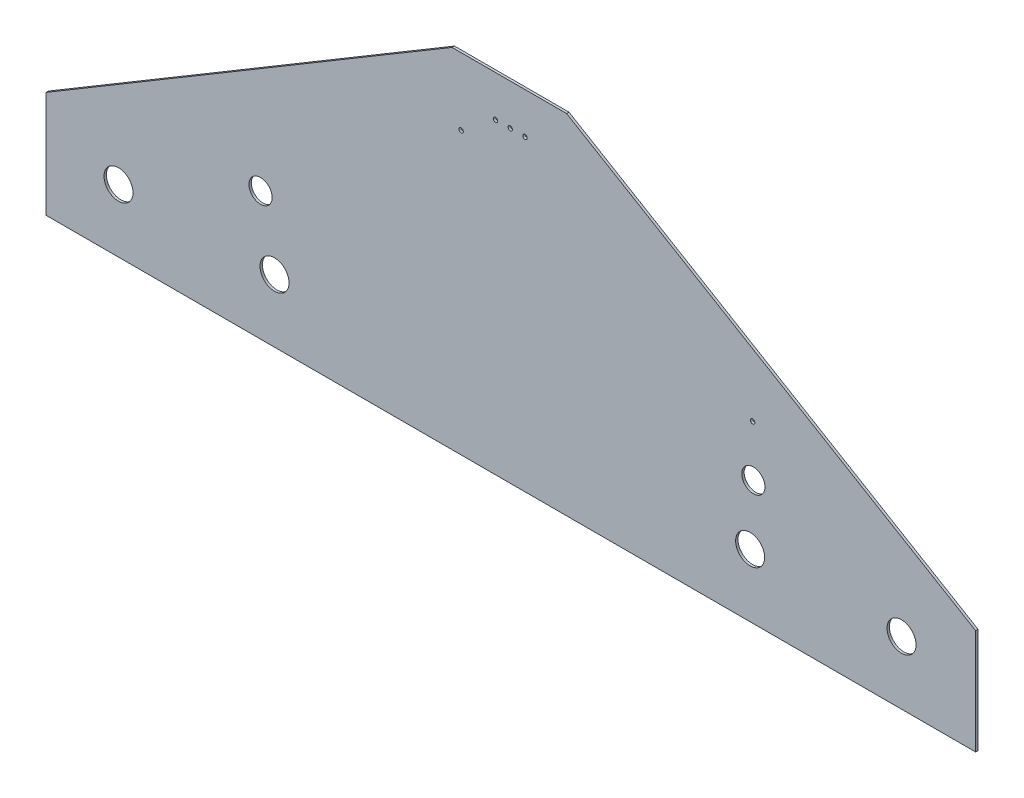
ISO-10303-21;
HEADER;
FILE_DESCRIPTION(('STEP AP214'),'2;1');
FILE_NAME('part.step','',(''),(''),'','','');
FILE_SCHEMA(('AUTOMOTIVE_DESIGN { 1 0 10303 214 1 1 1 1 }'));
ENDSEC;
DATA;
#1=APPLICATION_CONTEXT('core data for automotive mechanical design processes');
#2=APPLICATION_PROTOCOL_DEFINITION('international standard','automotive_design',2000,#1);
#3=PRODUCT_CONTEXT('',#1,'mechanical');
#4=PRODUCT('Part','Part','',(#3));
#5=PRODUCT_RELATED_PRODUCT_CATEGORY('part','',(#4));
#6=PRODUCT_DEFINITION_FORMATION('','',#4);
#7=PRODUCT_DEFINITION_CONTEXT('part definition',#1,'design');
#8=PRODUCT_DEFINITION('design','',#6,#7);
#9=PRODUCT_DEFINITION_SHAPE('','',#8);
#10=(LENGTH_UNIT() NAMED_UNIT(*) SI_UNIT(.MILLI.,.METRE.));
#11=(NAMED_UNIT(*) PLANE_ANGLE_UNIT() SI_UNIT($,.RADIAN.));
#12=(NAMED_UNIT(*) SI_UNIT($,.STERADIAN.) SOLID_ANGLE_UNIT());
#13=UNCERTAINTY_MEASURE_WITH_UNIT(LENGTH_MEASURE(1.E-05),#10,'distance_accuracy_value','');
#14=(GEOMETRIC_REPRESENTATION_CONTEXT(3) GLOBAL_UNCERTAINTY_ASSIGNED_CONTEXT((#13)) GLOBAL_UNIT_ASSIGNED_CONTEXT((#10,
#11,#12)) REPRESENTATION_CONTEXT('',''));
#15=CARTESIAN_POINT('',(0.,0.,0.));
#16=DIRECTION('',(0.,0.,1.));
#17=DIRECTION('',(1.,0.,0.));
#18=AXIS2_PLACEMENT_3D('',#15,#16,#17);
#19=CARTESIAN_POINT('',(0.5999988,0.5999988,0.41148));
#20=DIRECTION('',(0.,0.,1.));
#21=DIRECTION('',(1.,0.,0.));
#22=AXIS2_PLACEMENT_3D('',#19,#20,#21);
#23=PLANE('',#22);
#24=CARTESIAN_POINT('',(83.185,53.594,0.41148));
#25=DIRECTION('',(0.,0.,-1.));
#26=DIRECTION('',(-1.,0.,0.));
#27=AXIS2_PLACEMENT_3D('',#24,#25,#26);
#28=CIRCLE('',#27,0.381);
#29=CARTESIAN_POINT('',(82.804,53.594,0.41148));
#30=VERTEX_POINT('',#29);
#31=EDGE_CURVE('E124',#30,#30,#28,.T.);
#32=ORIENTED_EDGE('',*,*,#31,.T.);
#33=EDGE_LOOP('',(#32));
#34=FACE_BOUND('',#33,.T.);
#35=CARTESIAN_POINT('',(122.428,30.734,0.41148));
#36=DIRECTION('',(0.,0.,-1.));
#37=DIRECTION('',(-1.,0.,0.));
#38=AXIS2_PLACEMENT_3D('',#35,#36,#37);
#39=CIRCLE('',#38,0.381);
#40=CARTESIAN_POINT('',(122.047,30.734,0.41148));
#41=VERTEX_POINT('',#40);
#42=EDGE_CURVE('E127',#41,#41,#39,.T.);
#43=ORIENTED_EDGE('',*,*,#42,.T.);
#44=EDGE_LOOP('',(#43));
#45=FACE_BOUND('',#44,.T.);
#46=CARTESIAN_POINT('',(80.645,53.594,0.41148));
#47=DIRECTION('',(0.,0.,-1.));
#48=DIRECTION('',(-1.,0.,0.));
#49=AXIS2_PLACEMENT_3D('',#46,#47,#48);
#50=CIRCLE('',#49,0.381);
#51=CARTESIAN_POINT('',(80.264,53.594,0.41148));
#52=VERTEX_POINT('',#51);
#53=EDGE_CURVE('E130',#52,#52,#50,.T.);
#54=ORIENTED_EDGE('',*,*,#53,.T.);
#55=EDGE_LOOP('',(#54));
#56=FACE_BOUND('',#55,.T.);
#57=CARTESIAN_POINT('',(122.555,21.99999918,0.41148));
#58=DIRECTION('',(0.,0.,-1.));
#59=DIRECTION('',(-1.,0.,0.));
#60=AXIS2_PLACEMENT_3D('',#57,#58,#59);
#61=CIRCLE('',#60,1.99999854);
#62=CARTESIAN_POINT('',(120.55500146,21.99999918,0.41148));
#63=VERTEX_POINT('',#62);
#64=EDGE_CURVE('E133',#63,#63,#61,.T.);
#65=ORIENTED_EDGE('',*,*,#64,.T.);
#66=EDGE_LOOP('',(#65));
#67=FACE_BOUND('',#66,.T.);
#68=CARTESIAN_POINT('',(148.10000098,11.44999996,0.41148));
#69=DIRECTION('',(0.,0.,-1.));
#70=DIRECTION('',(-1.,0.,0.));
#71=AXIS2_PLACEMENT_3D('',#68,#69,#70);
#72=CIRCLE('',#71,2.50000008);
#73=CARTESIAN_POINT('',(145.6000009,11.44999996,0.41148));
#74=VERTEX_POINT('',#73);
#75=EDGE_CURVE('E136',#74,#74,#72,.T.);
#76=ORIENTED_EDGE('',*,*,#75,.T.);
#77=EDGE_LOOP('',(#76));
#78=FACE_BOUND('',#77,.T.);
#79=CARTESIAN_POINT('',(121.99999984,11.44999996,0.41148));
#80=DIRECTION('',(0.,0.,-1.));
#81=DIRECTION('',(-1.,0.,0.));
#82=AXIS2_PLACEMENT_3D('',#79,#80,#81);
#83=CIRCLE('',#82,2.50000008);
#84=CARTESIAN_POINT('',(119.49999976,11.44999996,0.41148));
#85=VERTEX_POINT('',#84);
#86=EDGE_CURVE('E139',#85,#85,#83,.T.);
#87=ORIENTED_EDGE('',*,*,#86,.T.);
#88=EDGE_LOOP('',(#87));
#89=FACE_BOUND('',#88,.T.);
#90=CARTESIAN_POINT('',(78.105,53.594,0.41148));
#91=DIRECTION('',(0.,0.,-1.));
#92=DIRECTION('',(-1.,0.,0.));
#93=AXIS2_PLACEMENT_3D('',#90,#91,#92);
#94=CIRCLE('',#93,0.381);
#95=CARTESIAN_POINT('',(77.724,53.594,0.41148));
#96=VERTEX_POINT('',#95);
#97=EDGE_CURVE('E142',#96,#96,#94,.T.);
#98=ORIENTED_EDGE('',*,*,#97,.T.);
#99=EDGE_LOOP('',(#98));
#100=FACE_BOUND('',#99,.T.);
#101=CARTESIAN_POINT('',(72.17158794,49.06349344,0.41148));
#102=DIRECTION('',(0.,0.,-1.));
#103=DIRECTION('',(-1.,0.,0.));
#104=AXIS2_PLACEMENT_3D('',#101,#102,#103);
#105=CIRCLE('',#104,0.381);
#106=CARTESIAN_POINT('',(71.79058794,49.06349344,0.41148));
#107=VERTEX_POINT('',#106);
#108=EDGE_CURVE('E145',#107,#107,#105,.T.);
#109=ORIENTED_EDGE('',*,*,#108,.T.);
#110=EDGE_LOOP('',(#109));
#111=FACE_BOUND('',#110,.T.);
#112=CARTESIAN_POINT('',(37.592,22.733,0.41148));
#113=DIRECTION('',(0.,0.,-1.));
#114=DIRECTION('',(-1.,0.,0.));
#115=AXIS2_PLACEMENT_3D('',#112,#113,#114);
#116=CIRCLE('',#115,1.99999854);
#117=CARTESIAN_POINT('',(35.59200146,22.733,0.41148));
#118=VERTEX_POINT('',#117);
#119=EDGE_CURVE('E148',#118,#118,#116,.T.);
#120=ORIENTED_EDGE('',*,*,#119,.T.);
#121=EDGE_LOOP('',(#120));
#122=FACE_BOUND('',#121,.T.);
#123=CARTESIAN_POINT('',(39.99999874,11.44999996,0.41148));
#124=DIRECTION('',(0.,0.,-1.));
#125=DIRECTION('',(-1.,0.,0.));
#126=AXIS2_PLACEMENT_3D('',#123,#124,#125);
#127=CIRCLE('',#126,2.50000008);
#128=CARTESIAN_POINT('',(37.49999866,11.44999996,0.41148));
#129=VERTEX_POINT('',#128);
#130=EDGE_CURVE('E150',#129,#129,#127,.T.);
#131=ORIENTED_EDGE('',*,*,#130,.T.);
#132=EDGE_LOOP('',(#131));
#133=FACE_BOUND('',#132,.T.);
#134=CARTESIAN_POINT('',(13.0999992,11.44999996,0.41148));
#135=DIRECTION('',(0.,0.,-1.));
#136=DIRECTION('',(-1.,0.,0.));
#137=AXIS2_PLACEMENT_3D('',#134,#135,#136);
#138=CIRCLE('',#137,2.50000008);
#139=CARTESIAN_POINT('',(10.59999912,11.44999996,0.41148));
#140=VERTEX_POINT('',#139);
#141=EDGE_CURVE('E17',#140,#140,#138,.T.);
#142=ORIENTED_EDGE('',*,*,#141,.T.);
#143=EDGE_LOOP('',(#142));
#144=FACE_BOUND('',#143,.T.);
#145=DIRECTION('',(-0.858999586489203,-0.511976279149121,0.));
#146=VECTOR('',#145,1.);
#147=CARTESIAN_POINT('',(0.60000134,18.94414296,0.41148));
#148=LINE('',#147,#146);
#149=CARTESIAN_POINT('',(0.600001340000001,18.94414296,0.41148));
#150=VERTEX_POINT('',#149);
#151=CARTESIAN_POINT('',(70.6098384599961,60.6710267400066,0.41148));
#152=VERTEX_POINT('',#151);
#153=EDGE_CURVE('E166',#150,#152,#148,.F.);
#154=ORIENTED_EDGE('',*,*,#153,.F.);
#155=DIRECTION('',(-1.38463805007299E-07,-0.99999999999999,0.));
#156=VECTOR('',#155,1.);
#157=CARTESIAN_POINT('',(0.5999988,0.5999988,0.41148));
#158=LINE('',#157,#156);
#159=CARTESIAN_POINT('',(0.599999435000001,0.5999988,0.41148));
#160=VERTEX_POINT('',#159);
#161=EDGE_CURVE('E82',#160,#150,#158,.F.);
#162=ORIENTED_EDGE('',*,*,#161,.F.);
#163=DIRECTION('',(1.,0.,0.));
#164=VECTOR('',#163,1.);
#165=CARTESIAN_POINT('',(160.8739988,0.5999988,0.41148));
#166=LINE('',#165,#164);
#167=CARTESIAN_POINT('',(160.8739988,0.599998799999999,0.41148));
#168=VERTEX_POINT('',#167);
#169=EDGE_CURVE('E78',#168,#160,#166,.F.);
#170=ORIENTED_EDGE('',*,*,#169,.F.);
#171=DIRECTION('',(-1.40170357279899E-07,0.99999999999999,0.));
#172=VECTOR('',#171,1.);
#173=CARTESIAN_POINT('',(160.87399626,18.72080584,0.41148));
#174=LINE('',#173,#172);
#175=CARTESIAN_POINT('',(160.873997529996,18.7208050844236,0.41148));
#176=VERTEX_POINT('',#175);
#177=EDGE_CURVE('E69',#176,#168,#174,.F.);
#178=ORIENTED_EDGE('',*,*,#177,.F.);
#179=DIRECTION('',(-0.85940677887988,0.511292468568929,0.));
#180=VECTOR('',#179,1.);
#181=CARTESIAN_POINT('',(90.36195034,60.67099626,0.41148));
#182=LINE('',#181,#180);
#183=CARTESIAN_POINT('',(90.36195034,60.67099626,0.41148));
#184=VERTEX_POINT('',#183);
#185=EDGE_CURVE('E64',#184,#176,#182,.F.);
#186=ORIENTED_EDGE('',*,*,#185,.F.);
#187=DIRECTION('',(-0.999999999998809,1.54312613175871E-06,0.));
#188=VECTOR('',#187,1.);
#189=CARTESIAN_POINT('',(70.60983846,60.67102674,0.41148));
#190=LINE('',#189,#188);
#191=EDGE_CURVE('E170',#152,#184,#190,.F.);
#192=ORIENTED_EDGE('',*,*,#191,.F.);
#193=EDGE_LOOP('',(#154,#162,#170,#178,#186,#192));
#194=FACE_BOUND('',#193,.T.);
#195=ADVANCED_FACE('F14',(#34,#45,#56,#67,#78,#89,#100,#111,#122,#133,#144,#194),#23,.T.);
#196=CARTESIAN_POINT('',(160.8739988,0.5999988,0.));
#197=DIRECTION('',(0.,-1.,0.));
#198=DIRECTION('',(0.,0.,-1.));
#199=AXIS2_PLACEMENT_3D('',#196,#197,#198);
#200=PLANE('',#199);
#201=DIRECTION('',(0.,0.,1.));
#202=VECTOR('',#201,1.);
#203=CARTESIAN_POINT('',(0.5999988,0.5999988,0.));
#204=LINE('',#203,#202);
#205=CARTESIAN_POINT('',(0.599999435000001,0.5999988,0.));
#206=VERTEX_POINT('',#205);
#207=EDGE_CURVE('E158',#206,#160,#204,.T.);
#208=ORIENTED_EDGE('',*,*,#207,.F.);
#209=DIRECTION('',(1.,0.,0.));
#210=VECTOR('',#209,1.);
#211=CARTESIAN_POINT('',(0.5999988,0.5999988,0.));
#212=LINE('',#211,#210);
#213=CARTESIAN_POINT('',(160.8739988,0.599998799999999,0.));
#214=VERTEX_POINT('',#213);
#215=EDGE_CURVE('E89',#206,#214,#212,.T.);
#216=ORIENTED_EDGE('',*,*,#215,.T.);
#217=DIRECTION('',(0.,0.,1.));
#218=VECTOR('',#217,1.);
#219=CARTESIAN_POINT('',(160.8739988,0.599998799999998,0.));
#220=LINE('',#219,#218);
#221=EDGE_CURVE('E74',#168,#214,#220,.F.);
#222=ORIENTED_EDGE('',*,*,#221,.F.);
#223=ORIENTED_EDGE('',*,*,#169,.T.);
#224=EDGE_LOOP('',(#208,#216,#222,#223));
#225=FACE_BOUND('',#224,.T.);
#226=ADVANCED_FACE('F88',(#225),#200,.T.);
#227=CARTESIAN_POINT('',(160.87399626,18.72080584,0.));
#228=DIRECTION('',(0.99999999999999,1.40170357279899E-07,0.));
#229=DIRECTION('',(-1.40170357279899E-07,0.99999999999999,0.));
#230=AXIS2_PLACEMENT_3D('',#227,#228,#229);
#231=PLANE('',#230);
#232=ORIENTED_EDGE('',*,*,#221,.T.);
#233=DIRECTION('',(0.,1.,0.));
#234=VECTOR('',#233,1.);
#235=CARTESIAN_POINT('',(160.8739988,0.5999988,0.));
#236=LINE('',#235,#234);
#237=CARTESIAN_POINT('',(160.873996894996,18.7208054622083,0.));
#238=VERTEX_POINT('',#237);
#239=EDGE_CURVE('E179',#214,#238,#236,.T.);
#240=ORIENTED_EDGE('',*,*,#239,.T.);
#241=DIRECTION('',(0.,0.,1.));
#242=VECTOR('',#241,1.);
#243=CARTESIAN_POINT('',(160.873996259983,18.7208058399719,0.));
#244=LINE('',#243,#242);
#245=EDGE_CURVE('E76',#176,#238,#244,.F.);
#246=ORIENTED_EDGE('',*,*,#245,.F.);
#247=ORIENTED_EDGE('',*,*,#177,.T.);
#248=EDGE_LOOP('',(#232,#240,#246,#247));
#249=FACE_BOUND('',#248,.T.);
#250=ADVANCED_FACE('F71',(#249),#231,.T.);
#251=CARTESIAN_POINT('',(90.36195034,60.67099626,0.));
#252=DIRECTION('',(0.511292468568929,0.85940677887988,0.));
#253=DIRECTION('',(-0.85940677887988,0.511292468568929,0.));
#254=AXIS2_PLACEMENT_3D('',#251,#252,#253);
#255=PLANE('',#254);
#256=ORIENTED_EDGE('',*,*,#245,.T.);
#257=DIRECTION('',(-0.859406778880083,0.511292468568587,0.));
#258=VECTOR('',#257,1.);
#259=CARTESIAN_POINT('',(160.87399626,18.72080584,0.));
#260=LINE('',#259,#258);
#261=CARTESIAN_POINT('',(90.36195034,60.67099626,0.));
#262=VERTEX_POINT('',#261);
#263=EDGE_CURVE('E174',#238,#262,#260,.T.);
#264=ORIENTED_EDGE('',*,*,#263,.T.);
#265=DIRECTION('',(0.,0.,1.));
#266=VECTOR('',#265,1.);
#267=CARTESIAN_POINT('',(90.36195034,60.67099626,0.));
#268=LINE('',#267,#266);
#269=EDGE_CURVE('E168',#184,#262,#268,.F.);
#270=ORIENTED_EDGE('',*,*,#269,.F.);
#271=ORIENTED_EDGE('',*,*,#185,.T.);
#272=EDGE_LOOP('',(#256,#264,#270,#271));
#273=FACE_BOUND('',#272,.T.);
#274=ADVANCED_FACE('F173',(#273),#255,.T.);
#275=CARTESIAN_POINT('',(70.60983846,60.67102674,0.));
#276=DIRECTION('',(1.54312613175871E-06,0.999999999998809,0.));
#277=DIRECTION('',(-0.999999999998809,1.54312613175871E-06,0.));
#278=AXIS2_PLACEMENT_3D('',#275,#276,#277);
#279=PLANE('',#278);
#280=ORIENTED_EDGE('',*,*,#269,.T.);
#281=DIRECTION('',(-0.99999999999881,1.54312613159079E-06,0.));
#282=VECTOR('',#281,1.);
#283=CARTESIAN_POINT('',(90.36195034,60.67099626,0.));
#284=LINE('',#283,#282);
#285=CARTESIAN_POINT('',(70.6098384599961,60.6710267400066,0.));
#286=VERTEX_POINT('',#285);
#287=EDGE_CURVE('E181',#262,#286,#284,.T.);
#288=ORIENTED_EDGE('',*,*,#287,.T.);
#289=DIRECTION('',(0.,0.,1.));
#290=VECTOR('',#289,1.);
#291=CARTESIAN_POINT('',(70.6098384599843,60.6710267400263,0.));
#292=LINE('',#291,#290);
#293=EDGE_CURVE('E164',#152,#286,#292,.F.);
#294=ORIENTED_EDGE('',*,*,#293,.F.);
#295=ORIENTED_EDGE('',*,*,#191,.T.);
#296=EDGE_LOOP('',(#280,#288,#294,#295));
#297=FACE_BOUND('',#296,.T.);
#298=ADVANCED_FACE('F194',(#297),#279,.T.);
#299=CARTESIAN_POINT('',(0.60000134,18.94414296,0.));
#300=DIRECTION('',(-0.511976279149121,0.858999586489203,0.));
#301=DIRECTION('',(-0.858999586489203,-0.511976279149121,0.));
#302=AXIS2_PLACEMENT_3D('',#299,#300,#301);
#303=PLANE('',#302);
#304=ORIENTED_EDGE('',*,*,#293,.T.);
#305=DIRECTION('',(-0.858999586489395,-0.511976279148799,0.));
#306=VECTOR('',#305,1.);
#307=CARTESIAN_POINT('',(70.60983846,60.67102674,0.));
#308=LINE('',#307,#306);
#309=CARTESIAN_POINT('',(0.60000134,18.94414296,0.));
#310=VERTEX_POINT('',#309);
#311=EDGE_CURVE('E185',#286,#310,#308,.T.);
#312=ORIENTED_EDGE('',*,*,#311,.T.);
#313=DIRECTION('',(0.,0.,1.));
#314=VECTOR('',#313,1.);
#315=CARTESIAN_POINT('',(0.60000134,18.94414296,0.));
#316=LINE('',#315,#314);
#317=EDGE_CURVE('E32',#150,#310,#316,.F.);
#318=ORIENTED_EDGE('',*,*,#317,.F.);
#319=ORIENTED_EDGE('',*,*,#153,.T.);
#320=EDGE_LOOP('',(#304,#312,#318,#319));
#321=FACE_BOUND('',#320,.T.);
#322=ADVANCED_FACE('F190',(#321),#303,.T.);
#323=CARTESIAN_POINT('',(0.5999988,0.5999988,0.));
#324=DIRECTION('',(-0.99999999999999,1.38463805007299E-07,0.));
#325=DIRECTION('',(-1.38463805007299E-07,-0.99999999999999,0.));
#326=AXIS2_PLACEMENT_3D('',#323,#324,#325);
#327=PLANE('',#326);
#328=ORIENTED_EDGE('',*,*,#317,.T.);
#329=DIRECTION('',(0.,1.,0.));
#330=VECTOR('',#329,1.);
#331=CARTESIAN_POINT('',(0.60000134,0.5999988,0.));
#332=LINE('',#331,#330);
#333=EDGE_CURVE('E123',#310,#206,#332,.F.);
#334=ORIENTED_EDGE('',*,*,#333,.T.);
#335=ORIENTED_EDGE('',*,*,#207,.T.);
#336=ORIENTED_EDGE('',*,*,#161,.T.);
#337=EDGE_LOOP('',(#328,#334,#335,#336));
#338=FACE_BOUND('',#337,.T.);
#339=ADVANCED_FACE('F188',(#338),#327,.T.);
#340=CARTESIAN_POINT('',(13.0999992,11.44999996,0.));
#341=DIRECTION('',(0.,0.,-1.));
#342=DIRECTION('',(-1.,0.,0.));
#343=AXIS2_PLACEMENT_3D('',#340,#341,#342);
#344=CYLINDRICAL_SURFACE('',#343,2.50000008);
#345=ORIENTED_EDGE('',*,*,#141,.F.);
#346=EDGE_LOOP('',(#345));
#347=FACE_BOUND('',#346,.T.);
#348=CARTESIAN_POINT('',(13.0999992,11.44999996,0.));
#349=DIRECTION('',(0.,0.,-1.));
#350=DIRECTION('',(-1.,0.,0.));
#351=AXIS2_PLACEMENT_3D('',#348,#349,#350);
#352=CIRCLE('',#351,2.50000008);
#353=CARTESIAN_POINT('',(10.59999912,11.44999996,0.));
#354=VERTEX_POINT('',#353);
#355=EDGE_CURVE('E120',#354,#354,#352,.T.);
#356=ORIENTED_EDGE('',*,*,#355,.T.);
#357=EDGE_LOOP('',(#356));
#358=FACE_BOUND('',#357,.T.);
#359=ADVANCED_FACE('F251',(#347,#358),#344,.F.);
#360=CARTESIAN_POINT('',(39.99999874,11.44999996,0.));
#361=DIRECTION('',(0.,0.,-1.));
#362=DIRECTION('',(-1.,0.,0.));
#363=AXIS2_PLACEMENT_3D('',#360,#361,#362);
#364=CYLINDRICAL_SURFACE('',#363,2.50000008);
#365=ORIENTED_EDGE('',*,*,#130,.F.);
#366=EDGE_LOOP('',(#365));
#367=FACE_BOUND('',#366,.T.);
#368=CARTESIAN_POINT('',(39.99999874,11.44999996,0.));
#369=DIRECTION('',(0.,0.,-1.));
#370=DIRECTION('',(-1.,0.,0.));
#371=AXIS2_PLACEMENT_3D('',#368,#369,#370);
#372=CIRCLE('',#371,2.50000008);
#373=CARTESIAN_POINT('',(37.49999866,11.44999996,0.));
#374=VERTEX_POINT('',#373);
#375=EDGE_CURVE('E117',#374,#374,#372,.T.);
#376=ORIENTED_EDGE('',*,*,#375,.T.);
#377=EDGE_LOOP('',(#376));
#378=FACE_BOUND('',#377,.T.);
#379=ADVANCED_FACE('F247',(#367,#378),#364,.F.);
#380=CARTESIAN_POINT('',(37.592,22.733,0.));
#381=DIRECTION('',(0.,0.,-1.));
#382=DIRECTION('',(-1.,0.,0.));
#383=AXIS2_PLACEMENT_3D('',#380,#381,#382);
#384=CYLINDRICAL_SURFACE('',#383,1.99999854);
#385=ORIENTED_EDGE('',*,*,#119,.F.);
#386=EDGE_LOOP('',(#385));
#387=FACE_BOUND('',#386,.T.);
#388=CARTESIAN_POINT('',(37.592,22.733,0.));
#389=DIRECTION('',(0.,0.,-1.));
#390=DIRECTION('',(-1.,0.,0.));
#391=AXIS2_PLACEMENT_3D('',#388,#389,#390);
#392=CIRCLE('',#391,1.99999854);
#393=CARTESIAN_POINT('',(35.59200146,22.733,0.));
#394=VERTEX_POINT('',#393);
#395=EDGE_CURVE('E114',#394,#394,#392,.T.);
#396=ORIENTED_EDGE('',*,*,#395,.T.);
#397=EDGE_LOOP('',(#396));
#398=FACE_BOUND('',#397,.T.);
#399=ADVANCED_FACE('F243',(#387,#398),#384,.F.);
#400=CARTESIAN_POINT('',(72.17158794,49.06349344,0.));
#401=DIRECTION('',(0.,0.,-1.));
#402=DIRECTION('',(-1.,0.,0.));
#403=AXIS2_PLACEMENT_3D('',#400,#401,#402);
#404=CYLINDRICAL_SURFACE('',#403,0.381);
#405=ORIENTED_EDGE('',*,*,#108,.F.);
#406=EDGE_LOOP('',(#405));
#407=FACE_BOUND('',#406,.T.);
#408=CARTESIAN_POINT('',(72.17158794,49.06349344,0.));
#409=DIRECTION('',(0.,0.,-1.));
#410=DIRECTION('',(-1.,0.,0.));
#411=AXIS2_PLACEMENT_3D('',#408,#409,#410);
#412=CIRCLE('',#411,0.381);
#413=CARTESIAN_POINT('',(71.79058794,49.06349344,0.));
#414=VERTEX_POINT('',#413);
#415=EDGE_CURVE('E111',#414,#414,#412,.T.);
#416=ORIENTED_EDGE('',*,*,#415,.T.);
#417=EDGE_LOOP('',(#416));
#418=FACE_BOUND('',#417,.T.);
#419=ADVANCED_FACE('F239',(#407,#418),#404,.F.);
#420=CARTESIAN_POINT('',(78.105,53.594,0.));
#421=DIRECTION('',(0.,0.,-1.));
#422=DIRECTION('',(-1.,0.,0.));
#423=AXIS2_PLACEMENT_3D('',#420,#421,#422);
#424=CYLINDRICAL_SURFACE('',#423,0.381);
#425=ORIENTED_EDGE('',*,*,#97,.F.);
#426=EDGE_LOOP('',(#425));
#427=FACE_BOUND('',#426,.T.);
#428=CARTESIAN_POINT('',(78.105,53.594,0.));
#429=DIRECTION('',(0.,0.,-1.));
#430=DIRECTION('',(-1.,0.,0.));
#431=AXIS2_PLACEMENT_3D('',#428,#429,#430);
#432=CIRCLE('',#431,0.381);
#433=CARTESIAN_POINT('',(77.724,53.594,0.));
#434=VERTEX_POINT('',#433);
#435=EDGE_CURVE('E108',#434,#434,#432,.T.);
#436=ORIENTED_EDGE('',*,*,#435,.T.);
#437=EDGE_LOOP('',(#436));
#438=FACE_BOUND('',#437,.T.);
#439=ADVANCED_FACE('F235',(#427,#438),#424,.F.);
#440=CARTESIAN_POINT('',(121.99999984,11.44999996,0.));
#441=DIRECTION('',(0.,0.,-1.));
#442=DIRECTION('',(-1.,0.,0.));
#443=AXIS2_PLACEMENT_3D('',#440,#441,#442);
#444=CYLINDRICAL_SURFACE('',#443,2.50000008);
#445=ORIENTED_EDGE('',*,*,#86,.F.);
#446=EDGE_LOOP('',(#445));
#447=FACE_BOUND('',#446,.T.);
#448=CARTESIAN_POINT('',(121.99999984,11.44999996,0.));
#449=DIRECTION('',(0.,0.,-1.));
#450=DIRECTION('',(-1.,0.,0.));
#451=AXIS2_PLACEMENT_3D('',#448,#449,#450);
#452=CIRCLE('',#451,2.50000008);
#453=CARTESIAN_POINT('',(119.49999976,11.44999996,0.));
#454=VERTEX_POINT('',#453);
#455=EDGE_CURVE('E105',#454,#454,#452,.T.);
#456=ORIENTED_EDGE('',*,*,#455,.T.);
#457=EDGE_LOOP('',(#456));
#458=FACE_BOUND('',#457,.T.);
#459=ADVANCED_FACE('F231',(#447,#458),#444,.F.);
#460=CARTESIAN_POINT('',(148.10000098,11.44999996,0.));
#461=DIRECTION('',(0.,0.,-1.));
#462=DIRECTION('',(-1.,0.,0.));
#463=AXIS2_PLACEMENT_3D('',#460,#461,#462);
#464=CYLINDRICAL_SURFACE('',#463,2.50000008);
#465=ORIENTED_EDGE('',*,*,#75,.F.);
#466=EDGE_LOOP('',(#465));
#467=FACE_BOUND('',#466,.T.);
#468=CARTESIAN_POINT('',(148.10000098,11.44999996,0.));
#469=DIRECTION('',(0.,0.,-1.));
#470=DIRECTION('',(-1.,0.,0.));
#471=AXIS2_PLACEMENT_3D('',#468,#469,#470);
#472=CIRCLE('',#471,2.50000008);
#473=CARTESIAN_POINT('',(145.6000009,11.44999996,0.));
#474=VERTEX_POINT('',#473);
#475=EDGE_CURVE('E102',#474,#474,#472,.T.);
#476=ORIENTED_EDGE('',*,*,#475,.T.);
#477=EDGE_LOOP('',(#476));
#478=FACE_BOUND('',#477,.T.);
#479=ADVANCED_FACE('F227',(#467,#478),#464,.F.);
#480=CARTESIAN_POINT('',(122.555,21.99999918,0.));
#481=DIRECTION('',(0.,0.,-1.));
#482=DIRECTION('',(-1.,0.,0.));
#483=AXIS2_PLACEMENT_3D('',#480,#481,#482);
#484=CYLINDRICAL_SURFACE('',#483,1.99999854);
#485=ORIENTED_EDGE('',*,*,#64,.F.);
#486=EDGE_LOOP('',(#485));
#487=FACE_BOUND('',#486,.T.);
#488=CARTESIAN_POINT('',(122.555,21.99999918,0.));
#489=DIRECTION('',(0.,0.,-1.));
#490=DIRECTION('',(-1.,0.,0.));
#491=AXIS2_PLACEMENT_3D('',#488,#489,#490);
#492=CIRCLE('',#491,1.99999854);
#493=CARTESIAN_POINT('',(120.55500146,21.99999918,0.));
#494=VERTEX_POINT('',#493);
#495=EDGE_CURVE('E99',#494,#494,#492,.T.);
#496=ORIENTED_EDGE('',*,*,#495,.T.);
#497=EDGE_LOOP('',(#496));
#498=FACE_BOUND('',#497,.T.);
#499=ADVANCED_FACE('F223',(#487,#498),#484,.F.);
#500=CARTESIAN_POINT('',(80.645,53.594,0.));
#501=DIRECTION('',(0.,0.,-1.));
#502=DIRECTION('',(-1.,0.,0.));
#503=AXIS2_PLACEMENT_3D('',#500,#501,#502);
#504=CYLINDRICAL_SURFACE('',#503,0.381);
#505=ORIENTED_EDGE('',*,*,#53,.F.);
#506=EDGE_LOOP('',(#505));
#507=FACE_BOUND('',#506,.T.);
#508=CARTESIAN_POINT('',(80.645,53.594,0.));
#509=DIRECTION('',(0.,0.,-1.));
#510=DIRECTION('',(-1.,0.,0.));
#511=AXIS2_PLACEMENT_3D('',#508,#509,#510);
#512=CIRCLE('',#511,0.381);
#513=CARTESIAN_POINT('',(80.264,53.594,0.));
#514=VERTEX_POINT('',#513);
#515=EDGE_CURVE('E96',#514,#514,#512,.T.);
#516=ORIENTED_EDGE('',*,*,#515,.T.);
#517=EDGE_LOOP('',(#516));
#518=FACE_BOUND('',#517,.T.);
#519=ADVANCED_FACE('F219',(#507,#518),#504,.F.);
#520=CARTESIAN_POINT('',(122.428,30.734,0.));
#521=DIRECTION('',(0.,0.,-1.));
#522=DIRECTION('',(-1.,0.,0.));
#523=AXIS2_PLACEMENT_3D('',#520,#521,#522);
#524=CYLINDRICAL_SURFACE('',#523,0.381);
#525=ORIENTED_EDGE('',*,*,#42,.F.);
#526=EDGE_LOOP('',(#525));
#527=FACE_BOUND('',#526,.T.);
#528=CARTESIAN_POINT('',(122.428,30.734,0.));
#529=DIRECTION('',(0.,0.,-1.));
#530=DIRECTION('',(-1.,0.,0.));
#531=AXIS2_PLACEMENT_3D('',#528,#529,#530);
#532=CIRCLE('',#531,0.381);
#533=CARTESIAN_POINT('',(122.047,30.734,0.));
#534=VERTEX_POINT('',#533);
#535=EDGE_CURVE('E23',#534,#534,#532,.T.);
#536=ORIENTED_EDGE('',*,*,#535,.T.);
#537=EDGE_LOOP('',(#536));
#538=FACE_BOUND('',#537,.T.);
#539=ADVANCED_FACE('F211',(#527,#538),#524,.F.);
#540=CARTESIAN_POINT('',(83.185,53.594,0.));
#541=DIRECTION('',(0.,0.,-1.));
#542=DIRECTION('',(-1.,0.,0.));
#543=AXIS2_PLACEMENT_3D('',#540,#541,#542);
#544=CYLINDRICAL_SURFACE('',#543,0.381);
#545=ORIENTED_EDGE('',*,*,#31,.F.);
#546=EDGE_LOOP('',(#545));
#547=FACE_BOUND('',#546,.T.);
#548=CARTESIAN_POINT('',(83.185,53.594,0.));
#549=DIRECTION('',(0.,0.,-1.));
#550=DIRECTION('',(-1.,0.,0.));
#551=AXIS2_PLACEMENT_3D('',#548,#549,#550);
#552=CIRCLE('',#551,0.381);
#553=CARTESIAN_POINT('',(82.804,53.594,0.));
#554=VERTEX_POINT('',#553);
#555=EDGE_CURVE('E9',#554,#554,#552,.T.);
#556=ORIENTED_EDGE('',*,*,#555,.T.);
#557=EDGE_LOOP('',(#556));
#558=FACE_BOUND('',#557,.T.);
#559=ADVANCED_FACE('F205',(#547,#558),#544,.F.);
#560=CARTESIAN_POINT('',(0.5999988,0.5999988,0.));
#561=DIRECTION('',(0.,0.,1.));
#562=DIRECTION('',(1.,0.,0.));
#563=AXIS2_PLACEMENT_3D('',#560,#561,#562);
#564=PLANE('',#563);
#565=ORIENTED_EDGE('',*,*,#555,.F.);
#566=EDGE_LOOP('',(#565));
#567=FACE_BOUND('',#566,.T.);
#568=ORIENTED_EDGE('',*,*,#535,.F.);
#569=EDGE_LOOP('',(#568));
#570=FACE_BOUND('',#569,.T.);
#571=ORIENTED_EDGE('',*,*,#515,.F.);
#572=EDGE_LOOP('',(#571));
#573=FACE_BOUND('',#572,.T.);
#574=ORIENTED_EDGE('',*,*,#495,.F.);
#575=EDGE_LOOP('',(#574));
#576=FACE_BOUND('',#575,.T.);
#577=ORIENTED_EDGE('',*,*,#475,.F.);
#578=EDGE_LOOP('',(#577));
#579=FACE_BOUND('',#578,.T.);
#580=ORIENTED_EDGE('',*,*,#455,.F.);
#581=EDGE_LOOP('',(#580));
#582=FACE_BOUND('',#581,.T.);
#583=ORIENTED_EDGE('',*,*,#435,.F.);
#584=EDGE_LOOP('',(#583));
#585=FACE_BOUND('',#584,.T.);
#586=ORIENTED_EDGE('',*,*,#415,.F.);
#587=EDGE_LOOP('',(#586));
#588=FACE_BOUND('',#587,.T.);
#589=ORIENTED_EDGE('',*,*,#395,.F.);
#590=EDGE_LOOP('',(#589));
#591=FACE_BOUND('',#590,.T.);
#592=ORIENTED_EDGE('',*,*,#375,.F.);
#593=EDGE_LOOP('',(#592));
#594=FACE_BOUND('',#593,.T.);
#595=ORIENTED_EDGE('',*,*,#355,.F.);
#596=EDGE_LOOP('',(#595));
#597=FACE_BOUND('',#596,.T.);
#598=ORIENTED_EDGE('',*,*,#311,.F.);
#599=ORIENTED_EDGE('',*,*,#287,.F.);
#600=ORIENTED_EDGE('',*,*,#263,.F.);
#601=ORIENTED_EDGE('',*,*,#239,.F.);
#602=ORIENTED_EDGE('',*,*,#215,.F.);
#603=ORIENTED_EDGE('',*,*,#333,.F.);
#604=EDGE_LOOP('',(#598,#599,#600,#601,#602,#603));
#605=FACE_BOUND('',#604,.T.);
#606=ADVANCED_FACE('F178',(#567,#570,#573,#576,#579,#582,#585,#588,#591,#594,#597,#605),#564,.F.);
#607=CLOSED_SHELL('',(#195,#226,#250,#274,#298,#322,#339,#359,#379,#399,#419,#439,#459,#479,
#499,#519,#539,#559,#606));
#608=MANIFOLD_SOLID_BREP('B1',#607);
#609=ADVANCED_BREP_SHAPE_REPRESENTATION('',(#18,#608),#14);
#610=SHAPE_DEFINITION_REPRESENTATION(#9,#609);
ENDSEC;
END-ISO-10303-21;
